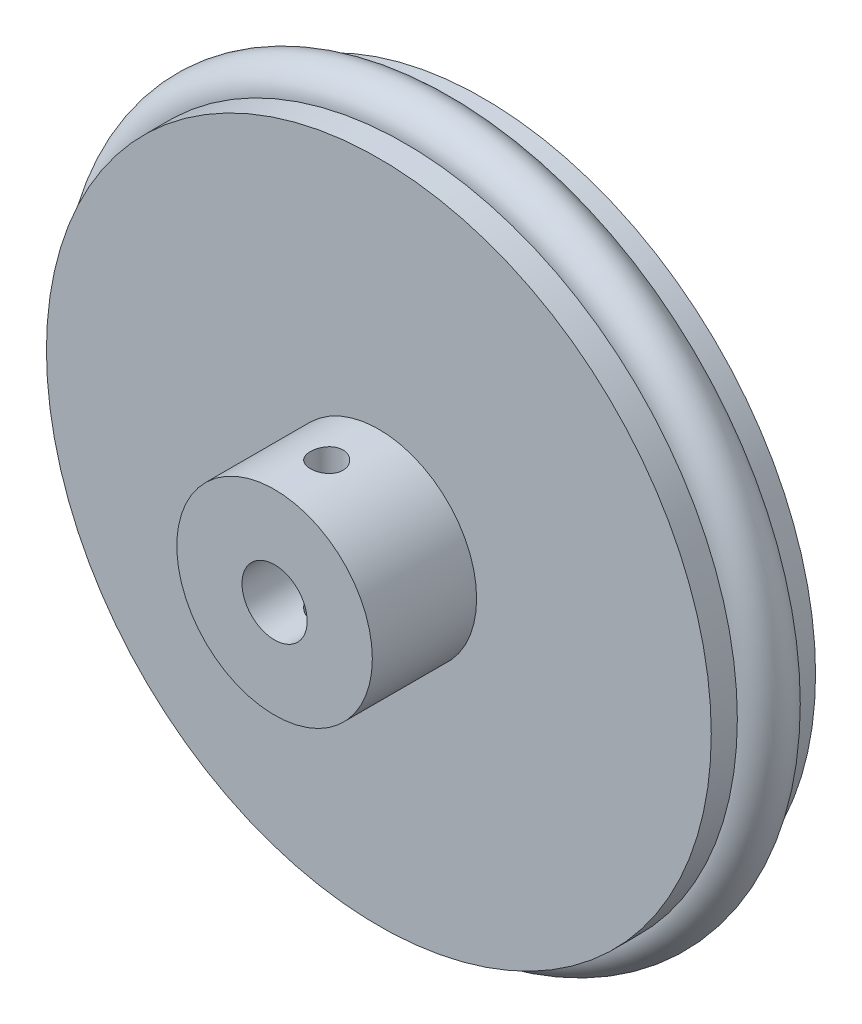
ISO-10303-21;
HEADER;
FILE_DESCRIPTION(('STEP AP214'),'2;1');
FILE_NAME('part.step','',(''),(''),'','','');
FILE_SCHEMA(('AUTOMOTIVE_DESIGN { 1 0 10303 214 1 1 1 1 }'));
ENDSEC;
DATA;
#1=APPLICATION_CONTEXT('core data for automotive mechanical design processes');
#2=APPLICATION_PROTOCOL_DEFINITION('international standard','automotive_design',2000,#1);
#3=PRODUCT_CONTEXT('',#1,'mechanical');
#4=PRODUCT('Part','Part','',(#3));
#5=PRODUCT_RELATED_PRODUCT_CATEGORY('part','',(#4));
#6=PRODUCT_DEFINITION_FORMATION('','',#4);
#7=PRODUCT_DEFINITION_CONTEXT('part definition',#1,'design');
#8=PRODUCT_DEFINITION('design','',#6,#7);
#9=PRODUCT_DEFINITION_SHAPE('','',#8);
#10=(LENGTH_UNIT() NAMED_UNIT(*) SI_UNIT(.MILLI.,.METRE.));
#11=(NAMED_UNIT(*) PLANE_ANGLE_UNIT() SI_UNIT($,.RADIAN.));
#12=(NAMED_UNIT(*) SI_UNIT($,.STERADIAN.) SOLID_ANGLE_UNIT());
#13=UNCERTAINTY_MEASURE_WITH_UNIT(LENGTH_MEASURE(1.E-05),#10,'distance_accuracy_value','');
#14=(GEOMETRIC_REPRESENTATION_CONTEXT(3) GLOBAL_UNCERTAINTY_ASSIGNED_CONTEXT((#13)) GLOBAL_UNIT_ASSIGNED_CONTEXT((#10,
#11,#12)) REPRESENTATION_CONTEXT('',''));
#15=CARTESIAN_POINT('',(0.,0.,0.));
#16=DIRECTION('',(0.,0.,1.));
#17=DIRECTION('',(1.,0.,0.));
#18=AXIS2_PLACEMENT_3D('',#15,#16,#17);
#19=CARTESIAN_POINT('',(0.,0.,7.99999999999997));
#20=DIRECTION('',(0.,0.,-1.));
#21=DIRECTION('',(-1.,0.,0.));
#22=AXIS2_PLACEMENT_3D('',#19,#20,#21);
#23=CYLINDRICAL_SURFACE('',#22,25.5);
#24=CARTESIAN_POINT('',(0.,0.,2.));
#25=DIRECTION('',(0.,0.,1.));
#26=DIRECTION('',(1.,0.,0.));
#27=AXIS2_PLACEMENT_3D('',#24,#25,#26);
#28=CIRCLE('',#27,25.5);
#29=CARTESIAN_POINT('',(25.5,0.,2.));
#30=VERTEX_POINT('',#29);
#31=EDGE_CURVE('E116',#30,#30,#28,.F.);
#32=ORIENTED_EDGE('',*,*,#31,.T.);
#33=EDGE_LOOP('',(#32));
#34=FACE_BOUND('',#33,.T.);
#35=CARTESIAN_POINT('',(0.,0.,0.));
#36=DIRECTION('',(0.,0.,1.));
#37=DIRECTION('',(1.,0.,0.));
#38=AXIS2_PLACEMENT_3D('',#35,#36,#37);
#39=CIRCLE('',#38,25.5);
#40=CARTESIAN_POINT('',(25.5,0.,0.));
#41=VERTEX_POINT('',#40);
#42=EDGE_CURVE('E48',#41,#41,#39,.T.);
#43=ORIENTED_EDGE('',*,*,#42,.T.);
#44=EDGE_LOOP('',(#43));
#45=FACE_BOUND('',#44,.T.);
#46=ADVANCED_FACE('F35',(#34,#45),#23,.T.);
#47=CARTESIAN_POINT('',(0.,0.,7.99999999999997));
#48=DIRECTION('',(0.,0.,-1.));
#49=DIRECTION('',(-1.,0.,0.));
#50=AXIS2_PLACEMENT_3D('',#47,#48,#49);
#51=CYLINDRICAL_SURFACE('',#50,2.5);
#52=CARTESIAN_POINT('',(0.,-2.5,10.75));
#53=CARTESIAN_POINT('',(0.0657149536912331,-2.49999641755189,10.7500041278993));
#54=CARTESIAN_POINT('',(0.131508249622541,-2.49738113774397,10.7552125914021));
#55=CARTESIAN_POINT('',(0.261150294085532,-2.48717695046745,10.7758161004261));
#56=CARTESIAN_POINT('',(0.32499510839188,-2.47957859786229,10.791230491247));
#57=CARTESIAN_POINT('',(0.448666931100718,-2.46020349254139,10.831492260771));
#58=CARTESIAN_POINT('',(0.508508503673974,-2.448442989719,10.85630298031));
#59=CARTESIAN_POINT('',(0.623090771008206,-2.42182220644723,10.9144632767061));
#60=CARTESIAN_POINT('',(0.677831867487562,-2.40696217041913,10.947812180311));
#61=CARTESIAN_POINT('',(0.784384772202399,-2.37445322822571,11.0243965618566));
#62=CARTESIAN_POINT('',(0.83581901390264,-2.3566899890942,11.0681080990495));
#63=CARTESIAN_POINT('',(0.930974306083721,-2.3207496280843,11.1631518490588));
#64=CARTESIAN_POINT('',(0.974689478883457,-2.30257220261294,11.2144898147155));
#65=CARTESIAN_POINT('',(1.05656500056285,-2.26623688996684,11.3281041869042));
#66=CARTESIAN_POINT('',(1.09403166943955,-2.24818983712665,11.3909201229324));
#67=CARTESIAN_POINT('',(1.15771028361337,-2.21607473465401,11.5229591699827));
#68=CARTESIAN_POINT('',(1.18393026870792,-2.20200384508737,11.5921776609034));
#69=CARTESIAN_POINT('',(1.22266555273574,-2.18072333797261,11.7308313817774));
#70=CARTESIAN_POINT('',(1.23590732135055,-2.17315339479642,11.8000055650842));
#71=CARTESIAN_POINT('',(1.25053374163606,-2.1647736243566,11.9399735472243));
#72=CARTESIAN_POINT('',(1.25193011046634,-2.1639571167911,12.0107656760889));
#73=CARTESIAN_POINT('',(1.24335910896537,-2.16888662821561,12.1428575303942));
#74=CARTESIAN_POINT('',(1.23473069942103,-2.17385954577517,12.2042800390288));
#75=CARTESIAN_POINT('',(1.20867481132117,-2.18845285917313,12.3246523867163));
#76=CARTESIAN_POINT('',(1.19124452987206,-2.1980747353972,12.3836014316316));
#77=CARTESIAN_POINT('',(1.1477622254825,-2.22109345515926,12.499036415707));
#78=CARTESIAN_POINT('',(1.12151883389499,-2.23457300829998,12.5554329984822));
#79=CARTESIAN_POINT('',(1.061302109585,-2.26379255351755,12.6632928657375));
#80=CARTESIAN_POINT('',(1.02732530476558,-2.27953355975238,12.7147539195001));
#81=CARTESIAN_POINT('',(0.947582568640986,-2.31391447379107,12.818151565929));
#82=CARTESIAN_POINT('',(0.900868072961602,-2.33266887795933,12.8693210919702));
#83=CARTESIAN_POINT('',(0.799444473426717,-2.36934529125509,12.9634192732386));
#84=CARTESIAN_POINT('',(0.744731570717857,-2.38726689948501,13.0063439900423));
#85=CARTESIAN_POINT('',(0.62564563228981,-2.42127484103705,13.0846070762871));
#86=CARTESIAN_POINT('',(0.56094198949926,-2.43723730202509,13.1195005905571));
#87=CARTESIAN_POINT('',(0.425582769360996,-2.46447351401553,13.1776212863037));
#88=CARTESIAN_POINT('',(0.354931970331596,-2.47575098679441,13.2008577312689));
#89=CARTESIAN_POINT('',(0.215958114575877,-2.49155417176795,13.2330942546458));
#90=CARTESIAN_POINT('',(0.147926913185405,-2.4965617287664,13.2431140446834));
#91=CARTESIAN_POINT('',(0.0109744999366921,-2.50091266823877,13.2518309139181));
#92=CARTESIAN_POINT('',(-0.0579462748373765,-2.5002587340164,13.2505333570493));
#93=CARTESIAN_POINT('',(-0.189041214982492,-2.49363990316801,13.2372416394765));
#94=CARTESIAN_POINT('',(-0.251324260062443,-2.48809057110237,13.2260843340874));
#95=CARTESIAN_POINT('',(-0.373008615377396,-2.47277714143524,13.1947024101311));
#96=CARTESIAN_POINT('',(-0.432409607113746,-2.46301257917916,13.1744767919333));
#97=CARTESIAN_POINT('',(-0.548610760562081,-2.43980314267087,13.1250019169585));
#98=CARTESIAN_POINT('',(-0.605287996257692,-2.42626102212424,13.095511187354));
#99=CARTESIAN_POINT('',(-0.713076702123651,-2.39679967896386,13.0286155804424));
#100=CARTESIAN_POINT('',(-0.764185787219102,-2.38087944457231,12.9912073317582));
#101=CARTESIAN_POINT('',(-0.864709611613316,-2.3463527667183,12.9052994683339));
#102=CARTESIAN_POINT('',(-0.913465097280798,-2.32763606060552,12.856071414433));
#103=CARTESIAN_POINT('',(-1.00232040139155,-2.29077989504843,12.7500935609133));
#104=CARTESIAN_POINT('',(-1.04241423211355,-2.27264084226908,12.6933386014795));
#105=CARTESIAN_POINT('',(-1.11463489312212,-2.23813990282585,12.5704454322496));
#106=CARTESIAN_POINT('',(-1.1462818698483,-2.2219066207934,12.5039859172392));
#107=CARTESIAN_POINT('',(-1.19760353251725,-2.19467590460158,12.3656124153843));
#108=CARTESIAN_POINT('',(-1.21729364485946,-2.18367172800773,12.2937055918735));
#109=CARTESIAN_POINT('',(-1.2423271093121,-2.16951876260833,12.1538622214232));
#110=CARTESIAN_POINT('',(-1.24886624550108,-2.16571729325614,12.0862071832137));
#111=CARTESIAN_POINT('',(-1.25086144297598,-2.16456693307719,11.9506911660366));
#112=CARTESIAN_POINT('',(-1.2463223082805,-2.16721524534441,11.8828302890757));
#113=CARTESIAN_POINT('',(-1.22740765699033,-2.17797327562531,11.7556456230849));
#114=CARTESIAN_POINT('',(-1.2140103929285,-2.18553868102992,11.6961244123195));
#115=CARTESIAN_POINT('',(-1.17896919778081,-2.20463770234897,11.5802398507191));
#116=CARTESIAN_POINT('',(-1.15732261394976,-2.21617259462094,11.523877522385));
#117=CARTESIAN_POINT('',(-1.10476968162585,-2.2428566295566,11.4117189362667));
#118=CARTESIAN_POINT('',(-1.07333892227057,-2.25819652995238,11.3562151227128));
#119=CARTESIAN_POINT('',(-1.00268871454579,-2.29044164543238,11.2509068297742));
#120=CARTESIAN_POINT('',(-0.963465214048311,-2.30734767243153,11.2011053368519));
#121=CARTESIAN_POINT('',(-0.872754158330802,-2.34327903949141,11.1023225220529));
#122=CARTESIAN_POINT('',(-0.820355528762715,-2.36231229139336,11.0541761220476));
#123=CARTESIAN_POINT('',(-0.70769350777535,-2.3984719031886,10.9671712707204));
#124=CARTESIAN_POINT('',(-0.647425904070982,-2.4155972326005,10.9283178257171));
#125=CARTESIAN_POINT('',(-0.519914496024934,-2.44622511981379,10.8609545465472));
#126=CARTESIAN_POINT('',(-0.452624379918268,-2.45970120703636,10.8325197882357));
#127=CARTESIAN_POINT('',(-0.313427626617739,-2.48126676704332,10.7877397901013));
#128=CARTESIAN_POINT('',(-0.241534749528958,-2.48937154216165,10.771360191463));
#129=CARTESIAN_POINT('',(-0.14075243310423,-2.49619327387079,10.7576282361552));
#130=CARTESIAN_POINT('',(-0.112702349299373,-2.49761706674002,10.7547716989204));
#131=CARTESIAN_POINT('',(-0.0564396647589469,-2.49952121222331,10.750956668104));
#132=CARTESIAN_POINT('',(-0.0282270595592266,-2.50000153879704,10.749998226911));
#133=CARTESIAN_POINT('',(0.,-2.5,10.75));
#134=B_SPLINE_CURVE_WITH_KNOTS('',3,(#52,#53,#54,#55,#56,#57,#58,#59,#60,#61,#62,#63,#64,#65,
#66,#67,#68,#69,#70,#71,#72,#73,#74,#75,#76,#77,#78,#79,#80,#81,#82,#83,#84,#85,#86,#87,#88,#89,
#90,#91,#92,#93,#94,#95,#96,#97,#98,#99,#100,#101,#102,#103,#104,#105,#106,#107,#108,#109,#110,
#111,#112,#113,#114,#115,#116,#117,#118,#119,#120,#121,#122,#123,#124,#125,#126,#127,#128,#129,
#130,#131,#132,#133),.UNSPECIFIED.,.T.,.F.,(4,2,2,2,2,2,2,2,2,2,2,2,2,2,2,2,2,2,2,2,2,2,2,2,2,2,
2,2,2,2,2,2,2,2,2,2,2,2,2,2,4),(0.,0.197030321775366,0.394435187136497,0.591077694365371,
0.78770470072696,0.996227198397611,1.20490779706754,1.42977158038441,1.65447434872851,
1.86572515175287,2.07676696661275,2.26257140511651,2.44843504907098,2.63862800210609,
2.82890651575277,3.04331176667348,3.25781918248358,3.48228777768051,3.70657771140349,
3.91229113089182,4.11790705639345,4.30758633132653,4.49728652038664,4.69241070034873,
4.88761813435424,5.10199513305523,5.3165198576929,5.54143352699593,5.76605639925972,
5.96911634372967,6.17208824825007,6.35572412805228,6.53941910979597,6.73545570969517,
6.93159451423697,7.15156553440623,7.37165479220716,7.59330017078656,7.81431135781163,
7.89894100172122,7.98357298143558),.UNSPECIFIED.);
#135=CARTESIAN_POINT('',(0.,-2.5,10.75));
#136=VERTEX_POINT('',#135);
#137=EDGE_CURVE('E80',#136,#136,#134,.T.);
#138=ORIENTED_EDGE('',*,*,#137,.T.);
#139=EDGE_LOOP('',(#138));
#140=FACE_BOUND('',#139,.T.);
#141=CARTESIAN_POINT('',(0.,0.,0.));
#142=DIRECTION('',(0.,0.,1.));
#143=DIRECTION('',(1.,0.,0.));
#144=AXIS2_PLACEMENT_3D('',#141,#142,#143);
#145=CIRCLE('',#144,2.5);
#146=CARTESIAN_POINT('',(2.5,0.,0.));
#147=VERTEX_POINT('',#146);
#148=EDGE_CURVE('E53',#147,#147,#145,.T.);
#149=ORIENTED_EDGE('',*,*,#148,.F.);
#150=EDGE_LOOP('',(#149));
#151=FACE_BOUND('',#150,.T.);
#152=CARTESIAN_POINT('',(0.,0.,16.));
#153=DIRECTION('',(0.,0.,1.));
#154=DIRECTION('',(1.,0.,0.));
#155=AXIS2_PLACEMENT_3D('',#152,#153,#154);
#156=CIRCLE('',#155,2.5);
#157=CARTESIAN_POINT('',(2.5,0.,16.));
#158=VERTEX_POINT('',#157);
#159=EDGE_CURVE('E203',#158,#158,#156,.T.);
#160=ORIENTED_EDGE('',*,*,#159,.T.);
#161=EDGE_LOOP('',(#160));
#162=FACE_BOUND('',#161,.T.);
#163=CARTESIAN_POINT('',(0.,2.5,10.75));
#164=CARTESIAN_POINT('',(-0.0657149536912331,2.49999641755189,10.7500041278993));
#165=CARTESIAN_POINT('',(-0.131508249622541,2.49738113774397,10.7552125914021));
#166=CARTESIAN_POINT('',(-0.261150294085532,2.48717695046745,10.7758161004261));
#167=CARTESIAN_POINT('',(-0.32499510839188,2.47957859786229,10.791230491247));
#168=CARTESIAN_POINT('',(-0.448666931100718,2.46020349254139,10.831492260771));
#169=CARTESIAN_POINT('',(-0.508508503673974,2.448442989719,10.85630298031));
#170=CARTESIAN_POINT('',(-0.623090771008206,2.42182220644723,10.9144632767061));
#171=CARTESIAN_POINT('',(-0.677831867487562,2.40696217041913,10.947812180311));
#172=CARTESIAN_POINT('',(-0.784384772202399,2.37445322822571,11.0243965618566));
#173=CARTESIAN_POINT('',(-0.83581901390264,2.3566899890942,11.0681080990495));
#174=CARTESIAN_POINT('',(-0.930974306083721,2.3207496280843,11.1631518490588));
#175=CARTESIAN_POINT('',(-0.974689478883457,2.30257220261294,11.2144898147155));
#176=CARTESIAN_POINT('',(-1.05656500056285,2.26623688996684,11.3281041869042));
#177=CARTESIAN_POINT('',(-1.09403166943955,2.24818983712665,11.3909201229324));
#178=CARTESIAN_POINT('',(-1.15771028361337,2.21607473465401,11.5229591699827));
#179=CARTESIAN_POINT('',(-1.18393026870792,2.20200384508737,11.5921776609034));
#180=CARTESIAN_POINT('',(-1.22266555273574,2.18072333797261,11.7308313817774));
#181=CARTESIAN_POINT('',(-1.23590732135055,2.17315339479642,11.8000055650842));
#182=CARTESIAN_POINT('',(-1.25053374163606,2.1647736243566,11.9399735472243));
#183=CARTESIAN_POINT('',(-1.25193011046634,2.1639571167911,12.0107656760889));
#184=CARTESIAN_POINT('',(-1.24335910896537,2.16888662821561,12.1428575303942));
#185=CARTESIAN_POINT('',(-1.23473069942103,2.17385954577517,12.2042800390288));
#186=CARTESIAN_POINT('',(-1.20867481132117,2.18845285917313,12.3246523867163));
#187=CARTESIAN_POINT('',(-1.19124452987206,2.1980747353972,12.3836014316316));
#188=CARTESIAN_POINT('',(-1.1477622254825,2.22109345515926,12.499036415707));
#189=CARTESIAN_POINT('',(-1.12151883389499,2.23457300829998,12.5554329984822));
#190=CARTESIAN_POINT('',(-1.061302109585,2.26379255351755,12.6632928657375));
#191=CARTESIAN_POINT('',(-1.02732530476558,2.27953355975238,12.7147539195001));
#192=CARTESIAN_POINT('',(-0.947582568640986,2.31391447379107,12.818151565929));
#193=CARTESIAN_POINT('',(-0.900868072961602,2.33266887795933,12.8693210919702));
#194=CARTESIAN_POINT('',(-0.799444473426717,2.36934529125509,12.9634192732386));
#195=CARTESIAN_POINT('',(-0.744731570717857,2.38726689948501,13.0063439900423));
#196=CARTESIAN_POINT('',(-0.62564563228981,2.42127484103705,13.0846070762871));
#197=CARTESIAN_POINT('',(-0.56094198949926,2.43723730202509,13.1195005905571));
#198=CARTESIAN_POINT('',(-0.425582769360996,2.46447351401553,13.1776212863037));
#199=CARTESIAN_POINT('',(-0.354931970331596,2.47575098679441,13.2008577312689));
#200=CARTESIAN_POINT('',(-0.215958114575877,2.49155417176795,13.2330942546458));
#201=CARTESIAN_POINT('',(-0.147926913185405,2.4965617287664,13.2431140446834));
#202=CARTESIAN_POINT('',(-0.0109744999366921,2.50091266823877,13.2518309139181));
#203=CARTESIAN_POINT('',(0.0579462748373765,2.5002587340164,13.2505333570493));
#204=CARTESIAN_POINT('',(0.189041214982492,2.49363990316801,13.2372416394765));
#205=CARTESIAN_POINT('',(0.251324260062443,2.48809057110237,13.2260843340874));
#206=CARTESIAN_POINT('',(0.373008615377396,2.47277714143524,13.1947024101311));
#207=CARTESIAN_POINT('',(0.432409607113746,2.46301257917916,13.1744767919333));
#208=CARTESIAN_POINT('',(0.548610760562081,2.43980314267087,13.1250019169585));
#209=CARTESIAN_POINT('',(0.605287996257692,2.42626102212424,13.095511187354));
#210=CARTESIAN_POINT('',(0.713076702123651,2.39679967896386,13.0286155804424));
#211=CARTESIAN_POINT('',(0.764185787219102,2.38087944457231,12.9912073317582));
#212=CARTESIAN_POINT('',(0.864709611613316,2.3463527667183,12.9052994683339));
#213=CARTESIAN_POINT('',(0.913465097280798,2.32763606060552,12.856071414433));
#214=CARTESIAN_POINT('',(1.00232040139155,2.29077989504843,12.7500935609133));
#215=CARTESIAN_POINT('',(1.04241423211355,2.27264084226908,12.6933386014795));
#216=CARTESIAN_POINT('',(1.11463489312212,2.23813990282585,12.5704454322496));
#217=CARTESIAN_POINT('',(1.1462818698483,2.2219066207934,12.5039859172392));
#218=CARTESIAN_POINT('',(1.19760353251725,2.19467590460158,12.3656124153843));
#219=CARTESIAN_POINT('',(1.21729364485946,2.18367172800773,12.2937055918735));
#220=CARTESIAN_POINT('',(1.2423271093121,2.16951876260833,12.1538622214232));
#221=CARTESIAN_POINT('',(1.24886624550108,2.16571729325614,12.0862071832137));
#222=CARTESIAN_POINT('',(1.25086144297598,2.16456693307719,11.9506911660366));
#223=CARTESIAN_POINT('',(1.2463223082805,2.16721524534441,11.8828302890757));
#224=CARTESIAN_POINT('',(1.22740765699033,2.17797327562531,11.7556456230849));
#225=CARTESIAN_POINT('',(1.2140103929285,2.18553868102992,11.6961244123195));
#226=CARTESIAN_POINT('',(1.17896919778081,2.20463770234897,11.5802398507191));
#227=CARTESIAN_POINT('',(1.15732261394976,2.21617259462094,11.523877522385));
#228=CARTESIAN_POINT('',(1.10476968162585,2.2428566295566,11.4117189362667));
#229=CARTESIAN_POINT('',(1.07333892227057,2.25819652995238,11.3562151227128));
#230=CARTESIAN_POINT('',(1.00268871454579,2.29044164543238,11.2509068297742));
#231=CARTESIAN_POINT('',(0.963465214048311,2.30734767243153,11.2011053368519));
#232=CARTESIAN_POINT('',(0.872754158330802,2.34327903949141,11.1023225220529));
#233=CARTESIAN_POINT('',(0.820355528762715,2.36231229139336,11.0541761220476));
#234=CARTESIAN_POINT('',(0.70769350777535,2.3984719031886,10.9671712707204));
#235=CARTESIAN_POINT('',(0.647425904070982,2.4155972326005,10.9283178257171));
#236=CARTESIAN_POINT('',(0.519914496024934,2.44622511981379,10.8609545465472));
#237=CARTESIAN_POINT('',(0.452624379918268,2.45970120703636,10.8325197882357));
#238=CARTESIAN_POINT('',(0.313427626617739,2.48126676704332,10.7877397901013));
#239=CARTESIAN_POINT('',(0.241534749528958,2.48937154216165,10.771360191463));
#240=CARTESIAN_POINT('',(0.14075243310423,2.49619327387079,10.7576282361552));
#241=CARTESIAN_POINT('',(0.112702349299373,2.49761706674002,10.7547716989204));
#242=CARTESIAN_POINT('',(0.0564396647589469,2.49952121222331,10.750956668104));
#243=CARTESIAN_POINT('',(0.0282270595592266,2.50000153879704,10.749998226911));
#244=CARTESIAN_POINT('',(0.,2.5,10.75));
#245=B_SPLINE_CURVE_WITH_KNOTS('',3,(#163,#164,#165,#166,#167,#168,#169,#170,#171,#172,#173,
#174,#175,#176,#177,#178,#179,#180,#181,#182,#183,#184,#185,#186,#187,#188,#189,#190,#191,#192,
#193,#194,#195,#196,#197,#198,#199,#200,#201,#202,#203,#204,#205,#206,#207,#208,#209,#210,#211,
#212,#213,#214,#215,#216,#217,#218,#219,#220,#221,#222,#223,#224,#225,#226,#227,#228,#229,#230,
#231,#232,#233,#234,#235,#236,#237,#238,#239,#240,#241,#242,#243,#244),.UNSPECIFIED.,.T.,.F.,(4,
2,2,2,2,2,2,2,2,2,2,2,2,2,2,2,2,2,2,2,2,2,2,2,2,2,2,2,2,2,2,2,2,2,2,2,2,2,2,2,4),(0.,
0.197030321775366,0.394435187136497,0.591077694365371,0.78770470072696,0.996227198397611,
1.20490779706754,1.42977158038441,1.65447434872851,1.86572515175287,2.07676696661275,
2.26257140511651,2.44843504907098,2.63862800210609,2.82890651575277,3.04331176667348,
3.25781918248358,3.48228777768051,3.70657771140349,3.91229113089182,4.11790705639345,
4.30758633132653,4.49728652038664,4.69241070034873,4.88761813435424,5.10199513305523,
5.3165198576929,5.54143352699593,5.76605639925972,5.96911634372967,6.17208824825007,
6.35572412805228,6.53941910979597,6.73545570969517,6.93159451423697,7.15156553440623,
7.37165479220716,7.59330017078656,7.81431135781163,7.89894100172122,7.98357298143558),.UNSPECIFIED.);
#246=CARTESIAN_POINT('',(0.,2.5,10.75));
#247=VERTEX_POINT('',#246);
#248=EDGE_CURVE('E86',#247,#247,#245,.T.);
#249=ORIENTED_EDGE('',*,*,#248,.T.);
#250=EDGE_LOOP('',(#249));
#251=FACE_BOUND('',#250,.T.);
#252=ADVANCED_FACE('F92',(#140,#151,#162,#251),#51,.F.);
#253=CARTESIAN_POINT('',(0.,0.,16.));
#254=DIRECTION('',(0.,0.,-1.));
#255=DIRECTION('',(-1.,0.,0.));
#256=AXIS2_PLACEMENT_3D('',#253,#254,#255);
#257=CYLINDRICAL_SURFACE('',#256,7.5);
#258=CARTESIAN_POINT('',(0.,0.,16.));
#259=DIRECTION('',(0.,0.,1.));
#260=DIRECTION('',(1.,0.,0.));
#261=AXIS2_PLACEMENT_3D('',#258,#259,#260);
#262=CIRCLE('',#261,7.5);
#263=CARTESIAN_POINT('',(7.5,0.,16.));
#264=VERTEX_POINT('',#263);
#265=EDGE_CURVE('E191',#264,#264,#262,.T.);
#266=ORIENTED_EDGE('',*,*,#265,.F.);
#267=EDGE_LOOP('',(#266));
#268=FACE_BOUND('',#267,.T.);
#269=CARTESIAN_POINT('',(0.,0.,7.99999999999997));
#270=DIRECTION('',(0.,0.,1.));
#271=DIRECTION('',(1.,0.,0.));
#272=AXIS2_PLACEMENT_3D('',#269,#270,#271);
#273=CIRCLE('',#272,7.5);
#274=CARTESIAN_POINT('',(7.5,0.,7.99999999999997));
#275=VERTEX_POINT('',#274);
#276=EDGE_CURVE('E195',#275,#275,#273,.T.);
#277=ORIENTED_EDGE('',*,*,#276,.T.);
#278=EDGE_LOOP('',(#277));
#279=FACE_BOUND('',#278,.T.);
#280=CARTESIAN_POINT('',(0.,-7.5,10.75));
#281=CARTESIAN_POINT('',(0.0696954524791075,-7.49999880584412,10.7500027944739));
#282=CARTESIAN_POINT('',(0.139428940919411,-7.49901838956517,10.7558486374844));
#283=CARTESIAN_POINT('',(0.276940110836522,-7.49520172470694,10.7790678293826));
#284=CARTESIAN_POINT('',(0.344715933979624,-7.49236376961945,10.7964517784558));
#285=CARTESIAN_POINT('',(0.476302373606322,-7.48515034118225,10.8422077242963));
#286=CARTESIAN_POINT('',(0.540116184215951,-7.48077612579596,10.8705707328203));
#287=CARTESIAN_POINT('',(0.662070920988973,-7.47097113541035,10.9374561460262));
#288=CARTESIAN_POINT('',(0.720212494939296,-7.46554048127217,10.9759773887415));
#289=CARTESIAN_POINT('',(0.82973630714584,-7.45416658729156,11.0624775419102));
#290=CARTESIAN_POINT('',(0.881056451767484,-7.44821935907428,11.110534557318));
#291=CARTESIAN_POINT('',(0.974944249329964,-7.43651313438366,11.2145739842364));
#292=CARTESIAN_POINT('',(1.01751134969549,-7.43075414981334,11.2705568957283));
#293=CARTESIAN_POINT('',(1.09293356280257,-7.4200378287989,11.3892854830985));
#294=CARTESIAN_POINT('',(1.1257272764305,-7.41508564545818,11.4520706684023));
#295=CARTESIAN_POINT('',(1.18027918270561,-7.40659894897337,11.5823547821503));
#296=CARTESIAN_POINT('',(1.20203812078281,-7.40306434007154,11.6498533918388));
#297=CARTESIAN_POINT('',(1.2337071888924,-7.39785268421378,11.7869901374282));
#298=CARTESIAN_POINT('',(1.2437245145677,-7.3961588424285,11.8566028682507));
#299=CARTESIAN_POINT('',(1.25195836264494,-7.39476969468325,11.9965401384417));
#300=CARTESIAN_POINT('',(1.2501757201945,-7.39507424728607,12.0668646270836));
#301=CARTESIAN_POINT('',(1.23494754919808,-7.39763214431778,12.2054639306377));
#302=CARTESIAN_POINT('',(1.22162244094489,-7.39986536659458,12.2737524017726));
#303=CARTESIAN_POINT('',(1.18387657020172,-7.40599747605504,12.4071106589145));
#304=CARTESIAN_POINT('',(1.15945542715987,-7.40989642036636,12.4721803344442));
#305=CARTESIAN_POINT('',(1.10008862304696,-7.4189423966705,12.5976144117204));
#306=CARTESIAN_POINT('',(1.06509295693986,-7.42409533553663,12.6579547030406));
#307=CARTESIAN_POINT('',(0.985606008778717,-7.43506459207504,12.7719522002692));
#308=CARTESIAN_POINT('',(0.941113960327143,-7.44088096327143,12.8256088662274));
#309=CARTESIAN_POINT('',(0.843241106079526,-7.45261013939893,12.9254130429036));
#310=CARTESIAN_POINT('',(0.789756981936564,-7.45852324615826,12.97145925927));
#311=CARTESIAN_POINT('',(0.675767624490824,-7.46971300698362,13.0539388813326));
#312=CARTESIAN_POINT('',(0.615262345953211,-7.47498965694873,13.0903722250916));
#313=CARTESIAN_POINT('',(0.488852958083355,-7.48431946446456,13.1526011135681));
#314=CARTESIAN_POINT('',(0.42294436278233,-7.48837159203724,13.1783877096656));
#315=CARTESIAN_POINT('',(0.287649172801365,-7.4947875150633,13.218497107623));
#316=CARTESIAN_POINT('',(0.218262869589734,-7.49715145175237,13.2328208684868));
#317=CARTESIAN_POINT('',(0.0788549506508116,-7.49990564921343,13.2494606792305));
#318=CARTESIAN_POINT('',(0.00885036857550535,-7.50031876506392,13.2519157859028));
#319=CARTESIAN_POINT('',(-0.130569886444944,-7.49918737210585,13.2451193277859));
#320=CARTESIAN_POINT('',(-0.19998558194602,-7.49764293862059,13.2358682134331));
#321=CARTESIAN_POINT('',(-0.335828087773382,-7.49278413469101,13.2060375753322));
#322=CARTESIAN_POINT('',(-0.40227043419269,-7.48948052400655,13.1855268958049));
#323=CARTESIAN_POINT('',(-0.530773442430221,-7.48147232227679,13.1338327409002));
#324=CARTESIAN_POINT('',(-0.59283385795486,-7.4767676525601,13.1026486661823));
#325=CARTESIAN_POINT('',(-0.711415344734479,-7.46642258151204,13.0301744376516));
#326=CARTESIAN_POINT('',(-0.767882625468574,-7.46077427943511,12.9887974219163));
#327=CARTESIAN_POINT('',(-0.873121792751344,-7.4491923369595,12.8972313423074));
#328=CARTESIAN_POINT('',(-0.921893119848292,-7.44325867585773,12.8470416383616));
#329=CARTESIAN_POINT('',(-1.010871389829,-7.43170087617923,12.7386512259643));
#330=CARTESIAN_POINT('',(-1.05098438055686,-7.42608058068553,12.6803729172428));
#331=CARTESIAN_POINT('',(-1.12085115514749,-7.41585764888942,12.5578235154307));
#332=CARTESIAN_POINT('',(-1.15060526738491,-7.4112549803301,12.4935526123862));
#333=CARTESIAN_POINT('',(-1.19876916573657,-7.40361726848852,12.3611051335939));
#334=CARTESIAN_POINT('',(-1.21722571627397,-7.40057577155532,12.2929459524847));
#335=CARTESIAN_POINT('',(-1.24241772688914,-7.3963885841763,12.1544399353891));
#336=CARTESIAN_POINT('',(-1.24915420597308,-7.39524272891361,12.0840932901339));
#337=CARTESIAN_POINT('',(-1.25068643302368,-7.39498366542006,11.9441474170188));
#338=CARTESIAN_POINT('',(-1.24563006806259,-7.39584528252825,11.8745498107123));
#339=CARTESIAN_POINT('',(-1.22403991947842,-7.39944890726864,11.7372103759746));
#340=CARTESIAN_POINT('',(-1.20750617305624,-7.40219090880607,11.669468541529));
#341=CARTESIAN_POINT('',(-1.16348724479745,-7.40923678140859,11.5378207813537));
#342=CARTESIAN_POINT('',(-1.13601479530022,-7.41353883609835,11.473910494972));
#343=CARTESIAN_POINT('',(-1.07091350195795,-7.42322184461104,11.3515821654025));
#344=CARTESIAN_POINT('',(-1.03328415437428,-7.428602851942,11.2931643948139));
#345=CARTESIAN_POINT('',(-0.948409442186078,-7.43991727022811,11.1827322084461));
#346=CARTESIAN_POINT('',(-0.901055281796825,-7.44585647788151,11.1308019916498));
#347=CARTESIAN_POINT('',(-0.798304515690116,-7.4575718618042,11.0355741977625));
#348=CARTESIAN_POINT('',(-0.742906056456318,-7.46334800013273,10.9922786156809));
#349=CARTESIAN_POINT('',(-0.62518458482014,-7.4741326482111,10.9152758659));
#350=CARTESIAN_POINT('',(-0.562816393766408,-7.47913558126552,10.8816369803435));
#351=CARTESIAN_POINT('',(-0.43325653468949,-7.48775583800888,10.825365257695));
#352=CARTESIAN_POINT('',(-0.366069747415004,-7.49137454088741,10.8027214594601));
#353=CARTESIAN_POINT('',(-0.2488516550227,-7.49602895416478,10.7739973629366));
#354=CARTESIAN_POINT('',(-0.199529415149224,-7.49751013636679,10.765012765192));
#355=CARTESIAN_POINT('',(-0.100144655159905,-7.4994960799306,10.7530131310776));
#356=CARTESIAN_POINT('',(-0.0500821478042472,-7.50000085810321,10.7499979919313));
#357=CARTESIAN_POINT('',(0.,-7.5,10.75));
#358=B_SPLINE_CURVE_WITH_KNOTS('',3,(#280,#281,#282,#283,#284,#285,#286,#287,#288,#289,#290,
#291,#292,#293,#294,#295,#296,#297,#298,#299,#300,#301,#302,#303,#304,#305,#306,#307,#308,#309,
#310,#311,#312,#313,#314,#315,#316,#317,#318,#319,#320,#321,#322,#323,#324,#325,#326,#327,#328,
#329,#330,#331,#332,#333,#334,#335,#336,#337,#338,#339,#340,#341,#342,#343,#344,#345,#346,#347,
#348,#349,#350,#351,#352,#353,#354,#355,#356,#357),.UNSPECIFIED.,.T.,.F.,(4,2,2,2,2,2,2,2,2,2,2,
2,2,2,2,2,2,2,2,2,2,2,2,2,2,2,2,2,2,2,2,2,2,2,2,2,2,2,4),(0.,0.208903292469255,0.41799877284771,
0.626923433512636,0.835824206337395,1.04651245531166,1.25721400084928,1.4692126041192,
1.68119688438091,1.89123038551712,2.10124902160443,2.30910260880204,2.51696332512691,
2.72582278316279,2.93469910340287,3.14616384955663,3.35762995817924,3.56927344457952,
3.78089922260574,3.99003941745699,4.1991715651793,4.40703903503208,4.61491817913033,
4.82463412813512,5.03436531527141,5.24626911003809,5.45816618687971,5.66918011170886,
5.88017568893309,6.0885395476135,6.29690273094066,6.50502409113111,6.71315577514668,
6.92375692096696,7.13440666939486,7.346511158036,7.55840376065036,7.70852124082009,
7.85863613638484),.UNSPECIFIED.);
#359=CARTESIAN_POINT('',(0.,-7.5,10.75));
#360=VERTEX_POINT('',#359);
#361=EDGE_CURVE('E57',#360,#360,#358,.T.);
#362=ORIENTED_EDGE('',*,*,#361,.F.);
#363=EDGE_LOOP('',(#362));
#364=FACE_BOUND('',#363,.T.);
#365=CARTESIAN_POINT('',(0.,7.5,10.75));
#366=CARTESIAN_POINT('',(-0.0696954524791075,7.49999880584412,10.7500027944739));
#367=CARTESIAN_POINT('',(-0.139428940919411,7.49901838956517,10.7558486374844));
#368=CARTESIAN_POINT('',(-0.276940110836522,7.49520172470694,10.7790678293826));
#369=CARTESIAN_POINT('',(-0.344715933979624,7.49236376961945,10.7964517784558));
#370=CARTESIAN_POINT('',(-0.476302373606322,7.48515034118225,10.8422077242963));
#371=CARTESIAN_POINT('',(-0.540116184215951,7.48077612579596,10.8705707328203));
#372=CARTESIAN_POINT('',(-0.662070920988973,7.47097113541035,10.9374561460262));
#373=CARTESIAN_POINT('',(-0.720212494939296,7.46554048127217,10.9759773887415));
#374=CARTESIAN_POINT('',(-0.82973630714584,7.45416658729156,11.0624775419102));
#375=CARTESIAN_POINT('',(-0.881056451767484,7.44821935907428,11.110534557318));
#376=CARTESIAN_POINT('',(-0.974944249329964,7.43651313438366,11.2145739842364));
#377=CARTESIAN_POINT('',(-1.01751134969549,7.43075414981334,11.2705568957283));
#378=CARTESIAN_POINT('',(-1.09293356280257,7.4200378287989,11.3892854830985));
#379=CARTESIAN_POINT('',(-1.1257272764305,7.41508564545818,11.4520706684023));
#380=CARTESIAN_POINT('',(-1.18027918270561,7.40659894897337,11.5823547821503));
#381=CARTESIAN_POINT('',(-1.20203812078281,7.40306434007154,11.6498533918388));
#382=CARTESIAN_POINT('',(-1.2337071888924,7.39785268421378,11.7869901374282));
#383=CARTESIAN_POINT('',(-1.2437245145677,7.3961588424285,11.8566028682507));
#384=CARTESIAN_POINT('',(-1.25195836264494,7.39476969468325,11.9965401384417));
#385=CARTESIAN_POINT('',(-1.2501757201945,7.39507424728607,12.0668646270836));
#386=CARTESIAN_POINT('',(-1.23494754919808,7.39763214431778,12.2054639306377));
#387=CARTESIAN_POINT('',(-1.22162244094489,7.39986536659458,12.2737524017726));
#388=CARTESIAN_POINT('',(-1.18387657020172,7.40599747605504,12.4071106589145));
#389=CARTESIAN_POINT('',(-1.15945542715987,7.40989642036636,12.4721803344442));
#390=CARTESIAN_POINT('',(-1.10008862304696,7.4189423966705,12.5976144117204));
#391=CARTESIAN_POINT('',(-1.06509295693986,7.42409533553663,12.6579547030406));
#392=CARTESIAN_POINT('',(-0.985606008778717,7.43506459207504,12.7719522002692));
#393=CARTESIAN_POINT('',(-0.941113960327143,7.44088096327143,12.8256088662274));
#394=CARTESIAN_POINT('',(-0.843241106079526,7.45261013939893,12.9254130429036));
#395=CARTESIAN_POINT('',(-0.789756981936564,7.45852324615826,12.97145925927));
#396=CARTESIAN_POINT('',(-0.675767624490824,7.46971300698362,13.0539388813326));
#397=CARTESIAN_POINT('',(-0.615262345953211,7.47498965694873,13.0903722250916));
#398=CARTESIAN_POINT('',(-0.488852958083355,7.48431946446456,13.1526011135681));
#399=CARTESIAN_POINT('',(-0.42294436278233,7.48837159203724,13.1783877096656));
#400=CARTESIAN_POINT('',(-0.287649172801365,7.4947875150633,13.218497107623));
#401=CARTESIAN_POINT('',(-0.218262869589734,7.49715145175237,13.2328208684868));
#402=CARTESIAN_POINT('',(-0.0788549506508116,7.49990564921343,13.2494606792305));
#403=CARTESIAN_POINT('',(-0.00885036857550535,7.50031876506392,13.2519157859028));
#404=CARTESIAN_POINT('',(0.130569886444944,7.49918737210585,13.2451193277859));
#405=CARTESIAN_POINT('',(0.19998558194602,7.49764293862059,13.2358682134331));
#406=CARTESIAN_POINT('',(0.335828087773382,7.49278413469101,13.2060375753322));
#407=CARTESIAN_POINT('',(0.40227043419269,7.48948052400655,13.1855268958049));
#408=CARTESIAN_POINT('',(0.530773442430221,7.48147232227679,13.1338327409002));
#409=CARTESIAN_POINT('',(0.59283385795486,7.4767676525601,13.1026486661823));
#410=CARTESIAN_POINT('',(0.711415344734479,7.46642258151204,13.0301744376516));
#411=CARTESIAN_POINT('',(0.767882625468574,7.46077427943511,12.9887974219163));
#412=CARTESIAN_POINT('',(0.873121792751344,7.4491923369595,12.8972313423074));
#413=CARTESIAN_POINT('',(0.921893119848292,7.44325867585773,12.8470416383616));
#414=CARTESIAN_POINT('',(1.010871389829,7.43170087617923,12.7386512259643));
#415=CARTESIAN_POINT('',(1.05098438055686,7.42608058068553,12.6803729172428));
#416=CARTESIAN_POINT('',(1.12085115514749,7.41585764888942,12.5578235154307));
#417=CARTESIAN_POINT('',(1.15060526738491,7.4112549803301,12.4935526123862));
#418=CARTESIAN_POINT('',(1.19876916573657,7.40361726848852,12.3611051335939));
#419=CARTESIAN_POINT('',(1.21722571627397,7.40057577155532,12.2929459524847));
#420=CARTESIAN_POINT('',(1.24241772688914,7.3963885841763,12.1544399353891));
#421=CARTESIAN_POINT('',(1.24915420597308,7.39524272891361,12.0840932901339));
#422=CARTESIAN_POINT('',(1.25068643302368,7.39498366542006,11.9441474170188));
#423=CARTESIAN_POINT('',(1.24563006806259,7.39584528252825,11.8745498107123));
#424=CARTESIAN_POINT('',(1.22403991947842,7.39944890726864,11.7372103759746));
#425=CARTESIAN_POINT('',(1.20750617305624,7.40219090880607,11.669468541529));
#426=CARTESIAN_POINT('',(1.16348724479745,7.40923678140859,11.5378207813537));
#427=CARTESIAN_POINT('',(1.13601479530022,7.41353883609835,11.473910494972));
#428=CARTESIAN_POINT('',(1.07091350195795,7.42322184461104,11.3515821654025));
#429=CARTESIAN_POINT('',(1.03328415437428,7.428602851942,11.2931643948139));
#430=CARTESIAN_POINT('',(0.948409442186078,7.43991727022811,11.1827322084461));
#431=CARTESIAN_POINT('',(0.901055281796825,7.44585647788151,11.1308019916498));
#432=CARTESIAN_POINT('',(0.798304515690116,7.4575718618042,11.0355741977625));
#433=CARTESIAN_POINT('',(0.742906056456318,7.46334800013273,10.9922786156809));
#434=CARTESIAN_POINT('',(0.62518458482014,7.4741326482111,10.9152758659));
#435=CARTESIAN_POINT('',(0.562816393766408,7.47913558126552,10.8816369803435));
#436=CARTESIAN_POINT('',(0.43325653468949,7.48775583800888,10.825365257695));
#437=CARTESIAN_POINT('',(0.366069747415004,7.49137454088741,10.8027214594601));
#438=CARTESIAN_POINT('',(0.2488516550227,7.49602895416478,10.7739973629366));
#439=CARTESIAN_POINT('',(0.199529415149224,7.49751013636679,10.765012765192));
#440=CARTESIAN_POINT('',(0.100144655159905,7.4994960799306,10.7530131310776));
#441=CARTESIAN_POINT('',(0.0500821478042472,7.50000085810321,10.7499979919313));
#442=CARTESIAN_POINT('',(0.,7.5,10.75));
#443=B_SPLINE_CURVE_WITH_KNOTS('',3,(#365,#366,#367,#368,#369,#370,#371,#372,#373,#374,#375,
#376,#377,#378,#379,#380,#381,#382,#383,#384,#385,#386,#387,#388,#389,#390,#391,#392,#393,#394,
#395,#396,#397,#398,#399,#400,#401,#402,#403,#404,#405,#406,#407,#408,#409,#410,#411,#412,#413,
#414,#415,#416,#417,#418,#419,#420,#421,#422,#423,#424,#425,#426,#427,#428,#429,#430,#431,#432,
#433,#434,#435,#436,#437,#438,#439,#440,#441,#442),.UNSPECIFIED.,.T.,.F.,(4,2,2,2,2,2,2,2,2,2,2,
2,2,2,2,2,2,2,2,2,2,2,2,2,2,2,2,2,2,2,2,2,2,2,2,2,2,2,4),(0.,0.208903292469255,0.41799877284771,
0.626923433512636,0.835824206337395,1.04651245531166,1.25721400084928,1.4692126041192,
1.68119688438091,1.89123038551712,2.10124902160443,2.30910260880204,2.51696332512691,
2.72582278316279,2.93469910340287,3.14616384955663,3.35762995817924,3.56927344457952,
3.78089922260574,3.99003941745699,4.1991715651793,4.40703903503208,4.61491817913033,
4.82463412813512,5.03436531527141,5.24626911003809,5.45816618687971,5.66918011170886,
5.88017568893309,6.0885395476135,6.29690273094066,6.50502409113111,6.71315577514668,
6.92375692096696,7.13440666939486,7.346511158036,7.55840376065036,7.70852124082009,
7.85863613638484),.UNSPECIFIED.);
#444=CARTESIAN_POINT('',(0.,7.5,10.75));
#445=VERTEX_POINT('',#444);
#446=EDGE_CURVE('E39',#445,#445,#443,.T.);
#447=ORIENTED_EDGE('',*,*,#446,.F.);
#448=EDGE_LOOP('',(#447));
#449=FACE_BOUND('',#448,.T.);
#450=ADVANCED_FACE('F63',(#268,#279,#364,#449),#257,.T.);
#451=CARTESIAN_POINT('',(0.,0.,7.99999999999997));
#452=DIRECTION('',(0.,0.,1.));
#453=DIRECTION('',(1.,0.,0.));
#454=AXIS2_PLACEMENT_3D('',#451,#452,#453);
#455=PLANE('',#454);
#456=CARTESIAN_POINT('',(0.,0.,7.99999999999997));
#457=DIRECTION('',(0.,0.,1.));
#458=DIRECTION('',(1.,0.,0.));
#459=AXIS2_PLACEMENT_3D('',#456,#457,#458);
#460=CIRCLE('',#459,25.5);
#461=CARTESIAN_POINT('',(25.5,0.,7.99999999999997));
#462=VERTEX_POINT('',#461);
#463=EDGE_CURVE('E10',#462,#462,#460,.T.);
#464=ORIENTED_EDGE('',*,*,#463,.T.);
#465=EDGE_LOOP('',(#464));
#466=FACE_BOUND('',#465,.T.);
#467=ORIENTED_EDGE('',*,*,#276,.F.);
#468=EDGE_LOOP('',(#467));
#469=FACE_BOUND('',#468,.T.);
#470=ADVANCED_FACE('F97',(#466,#469),#455,.T.);
#471=CARTESIAN_POINT('',(0.,0.,0.));
#472=DIRECTION('',(0.,0.,1.));
#473=DIRECTION('',(1.,0.,0.));
#474=AXIS2_PLACEMENT_3D('',#471,#472,#473);
#475=PLANE('',#474);
#476=ORIENTED_EDGE('',*,*,#42,.F.);
#477=EDGE_LOOP('',(#476));
#478=FACE_BOUND('',#477,.T.);
#479=ORIENTED_EDGE('',*,*,#148,.T.);
#480=EDGE_LOOP('',(#479));
#481=FACE_BOUND('',#480,.T.);
#482=ADVANCED_FACE('F100',(#478,#481),#475,.F.);
#483=CARTESIAN_POINT('',(0.,0.,6.));
#484=DIRECTION('',(0.,0.,-1.));
#485=DIRECTION('',(-1.,0.,0.));
#486=AXIS2_PLACEMENT_3D('',#483,#484,#485);
#487=CIRCLE('',#486,25.5);
#488=CARTESIAN_POINT('',(-25.5,0.,6.));
#489=VERTEX_POINT('',#488);
#490=EDGE_CURVE('E62',#489,#489,#487,.T.);
#491=ORIENTED_EDGE('',*,*,#490,.F.);
#492=EDGE_LOOP('',(#491));
#493=FACE_BOUND('',#492,.T.);
#494=ORIENTED_EDGE('',*,*,#463,.F.);
#495=EDGE_LOOP('',(#494));
#496=FACE_BOUND('',#495,.T.);
#497=ADVANCED_FACE('F37',(#493,#496),#23,.T.);
#498=CARTESIAN_POINT('',(0.,0.,16.));
#499=DIRECTION('',(0.,0.,1.));
#500=DIRECTION('',(1.,0.,0.));
#501=AXIS2_PLACEMENT_3D('',#498,#499,#500);
#502=PLANE('',#501);
#503=ORIENTED_EDGE('',*,*,#265,.T.);
#504=EDGE_LOOP('',(#503));
#505=FACE_BOUND('',#504,.T.);
#506=ORIENTED_EDGE('',*,*,#159,.F.);
#507=EDGE_LOOP('',(#506));
#508=FACE_BOUND('',#507,.T.);
#509=ADVANCED_FACE('F74',(#505,#508),#502,.T.);
#510=CARTESIAN_POINT('',(0.,10.,12.));
#511=DIRECTION('',(0.,-1.,0.));
#512=DIRECTION('',(0.,0.,-1.));
#513=AXIS2_PLACEMENT_3D('',#510,#511,#512);
#514=CYLINDRICAL_SURFACE('',#513,1.25);
#515=ORIENTED_EDGE('',*,*,#137,.F.);
#516=EDGE_LOOP('',(#515));
#517=FACE_BOUND('',#516,.T.);
#518=ORIENTED_EDGE('',*,*,#361,.T.);
#519=EDGE_LOOP('',(#518));
#520=FACE_BOUND('',#519,.T.);
#521=ADVANCED_FACE('F72',(#517,#520),#514,.F.);
#522=ORIENTED_EDGE('',*,*,#248,.F.);
#523=EDGE_LOOP('',(#522));
#524=FACE_BOUND('',#523,.T.);
#525=ORIENTED_EDGE('',*,*,#446,.T.);
#526=EDGE_LOOP('',(#525));
#527=FACE_BOUND('',#526,.T.);
#528=ADVANCED_FACE('F67',(#524,#527),#514,.F.);
#529=CARTESIAN_POINT('',(0.,0.,4.));
#530=DIRECTION('',(0.,0.,-1.));
#531=DIRECTION('',(-1.,0.,0.));
#532=AXIS2_PLACEMENT_3D('',#529,#530,#531);
#533=TOROIDAL_SURFACE('',#532,25.5,2.);
#534=ORIENTED_EDGE('',*,*,#31,.F.);
#535=EDGE_LOOP('',(#534));
#536=FACE_BOUND('',#535,.T.);
#537=ORIENTED_EDGE('',*,*,#490,.T.);
#538=EDGE_LOOP('',(#537));
#539=FACE_BOUND('',#538,.T.);
#540=ADVANCED_FACE('F71',(#536,#539),#533,.T.);
#541=CLOSED_SHELL('',(#46,#252,#450,#470,#482,#497,#509,#521,#528,#540));
#542=MANIFOLD_SOLID_BREP('B2',#541);
#543=ADVANCED_BREP_SHAPE_REPRESENTATION('',(#18,#542),#14);
#544=SHAPE_DEFINITION_REPRESENTATION(#9,#543);
ENDSEC;
END-ISO-10303-21;
